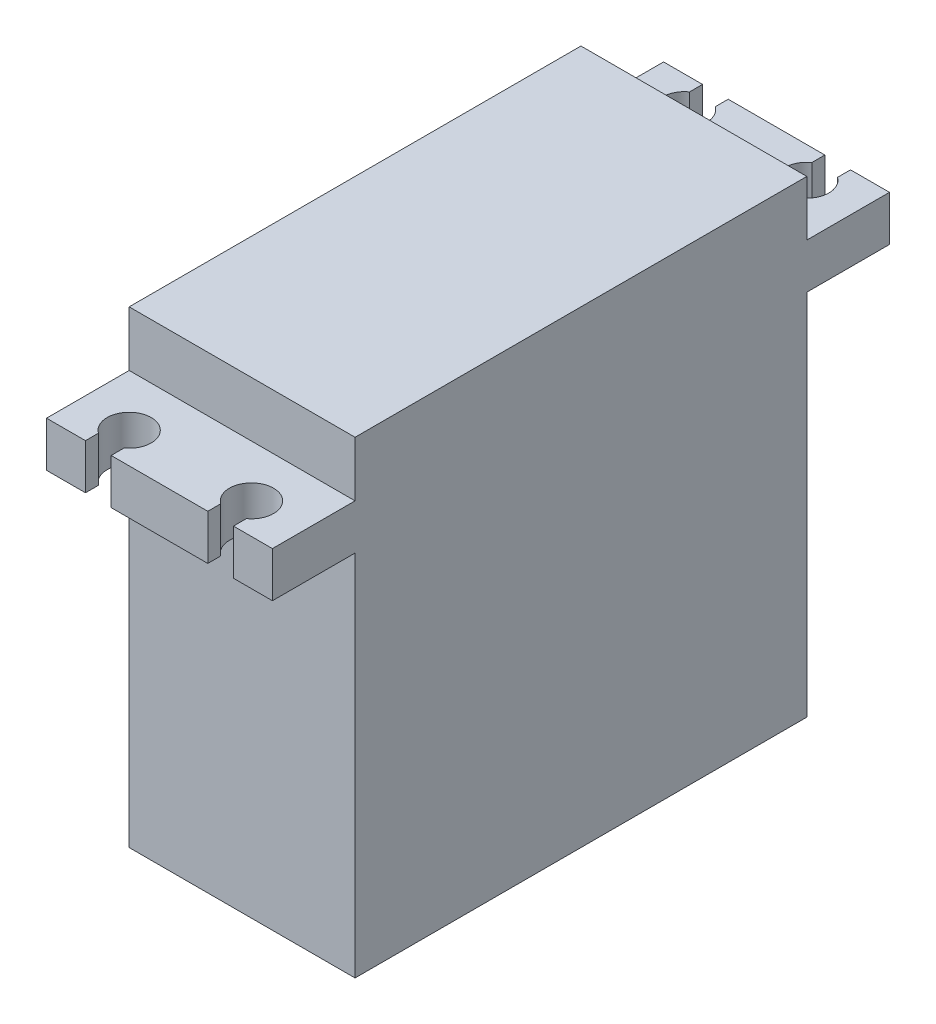
ISO-10303-21;
HEADER;
FILE_DESCRIPTION(('STEP AP214'),'2;1');
FILE_NAME('part.step','',(''),(''),'','','');
FILE_SCHEMA(('AUTOMOTIVE_DESIGN { 1 0 10303 214 1 1 1 1 }'));
ENDSEC;
DATA;
#1=APPLICATION_CONTEXT('core data for automotive mechanical design processes');
#2=APPLICATION_PROTOCOL_DEFINITION('international standard','automotive_design',2000,#1);
#3=PRODUCT_CONTEXT('',#1,'mechanical');
#4=PRODUCT('Part','Part','',(#3));
#5=PRODUCT_RELATED_PRODUCT_CATEGORY('part','',(#4));
#6=PRODUCT_DEFINITION_FORMATION('','',#4);
#7=PRODUCT_DEFINITION_CONTEXT('part definition',#1,'design');
#8=PRODUCT_DEFINITION('design','',#6,#7);
#9=PRODUCT_DEFINITION_SHAPE('','',#8);
#10=(LENGTH_UNIT() NAMED_UNIT(*) SI_UNIT(.MILLI.,.METRE.));
#11=(NAMED_UNIT(*) PLANE_ANGLE_UNIT() SI_UNIT($,.RADIAN.));
#12=(NAMED_UNIT(*) SI_UNIT($,.STERADIAN.) SOLID_ANGLE_UNIT());
#13=UNCERTAINTY_MEASURE_WITH_UNIT(LENGTH_MEASURE(1.E-05),#10,'distance_accuracy_value','');
#14=(GEOMETRIC_REPRESENTATION_CONTEXT(3) GLOBAL_UNCERTAINTY_ASSIGNED_CONTEXT((#13)) GLOBAL_UNIT_ASSIGNED_CONTEXT((#10,
#11,#12)) REPRESENTATION_CONTEXT('',''));
#15=CARTESIAN_POINT('',(0.,0.,0.));
#16=DIRECTION('',(0.,0.,1.));
#17=DIRECTION('',(1.,0.,0.));
#18=AXIS2_PLACEMENT_3D('',#15,#16,#17);
#19=CARTESIAN_POINT('',(0.,42.5,-20.5));
#20=DIRECTION('',(0.,0.,-1.));
#21=DIRECTION('',(-1.,0.,0.));
#22=AXIS2_PLACEMENT_3D('',#19,#20,#21);
#23=PLANE('',#22);
#24=DIRECTION('',(0.,-1.,0.));
#25=VECTOR('',#24,1.);
#26=CARTESIAN_POINT('',(-10.25,42.5,-20.5));
#27=LINE('',#26,#25);
#28=CARTESIAN_POINT('',(-10.25,33.4,-20.5));
#29=VERTEX_POINT('',#28);
#30=CARTESIAN_POINT('',(-10.25,0.,-20.5));
#31=VERTEX_POINT('',#30);
#32=EDGE_CURVE('E55',#29,#31,#27,.T.);
#33=ORIENTED_EDGE('',*,*,#32,.F.);
#34=DIRECTION('',(1.,0.,0.));
#35=VECTOR('',#34,1.);
#36=CARTESIAN_POINT('',(0.,33.4,-20.5));
#37=LINE('',#36,#35);
#38=CARTESIAN_POINT('',(10.25,33.4,-20.5));
#39=VERTEX_POINT('',#38);
#40=EDGE_CURVE('E50',#29,#39,#37,.T.);
#41=ORIENTED_EDGE('',*,*,#40,.T.);
#42=DIRECTION('',(0.,-1.,0.));
#43=VECTOR('',#42,1.);
#44=CARTESIAN_POINT('',(10.25,42.5,-20.5));
#45=LINE('',#44,#43);
#46=CARTESIAN_POINT('',(10.25,0.,-20.5));
#47=VERTEX_POINT('',#46);
#48=EDGE_CURVE('E43',#39,#47,#45,.T.);
#49=ORIENTED_EDGE('',*,*,#48,.T.);
#50=DIRECTION('',(1.,0.,0.));
#51=VECTOR('',#50,1.);
#52=CARTESIAN_POINT('',(0.,0.,-20.5));
#53=LINE('',#52,#51);
#54=EDGE_CURVE('E348',#31,#47,#53,.T.);
#55=ORIENTED_EDGE('',*,*,#54,.F.);
#56=EDGE_LOOP('',(#33,#41,#49,#55));
#57=FACE_BOUND('',#56,.T.);
#58=ADVANCED_FACE('F35',(#57),#23,.T.);
#59=CARTESIAN_POINT('',(0.,42.5,20.5));
#60=DIRECTION('',(0.,0.,-1.));
#61=DIRECTION('',(-1.,0.,0.));
#62=AXIS2_PLACEMENT_3D('',#59,#60,#61);
#63=PLANE('',#62);
#64=DIRECTION('',(1.,0.,0.));
#65=VECTOR('',#64,1.);
#66=CARTESIAN_POINT('',(0.,33.4,20.5));
#67=LINE('',#66,#65);
#68=CARTESIAN_POINT('',(-10.25,33.4,20.5));
#69=VERTEX_POINT('',#68);
#70=CARTESIAN_POINT('',(10.25,33.4,20.5));
#71=VERTEX_POINT('',#70);
#72=EDGE_CURVE('E303',#69,#71,#67,.T.);
#73=ORIENTED_EDGE('',*,*,#72,.F.);
#74=DIRECTION('',(0.,-1.,0.));
#75=VECTOR('',#74,1.);
#76=CARTESIAN_POINT('',(-10.25,42.5,20.5));
#77=LINE('',#76,#75);
#78=CARTESIAN_POINT('',(-10.25,0.,20.5));
#79=VERTEX_POINT('',#78);
#80=EDGE_CURVE('E359',#69,#79,#77,.T.);
#81=ORIENTED_EDGE('',*,*,#80,.T.);
#82=DIRECTION('',(1.,0.,0.));
#83=VECTOR('',#82,1.);
#84=CARTESIAN_POINT('',(0.,0.,20.5));
#85=LINE('',#84,#83);
#86=CARTESIAN_POINT('',(10.25,0.,20.5));
#87=VERTEX_POINT('',#86);
#88=EDGE_CURVE('E338',#79,#87,#85,.T.);
#89=ORIENTED_EDGE('',*,*,#88,.T.);
#90=DIRECTION('',(0.,-1.,0.));
#91=VECTOR('',#90,1.);
#92=CARTESIAN_POINT('',(10.25,42.5,20.5));
#93=LINE('',#92,#91);
#94=EDGE_CURVE('E345',#71,#87,#93,.T.);
#95=ORIENTED_EDGE('',*,*,#94,.F.);
#96=EDGE_LOOP('',(#73,#81,#89,#95));
#97=FACE_BOUND('',#96,.T.);
#98=ADVANCED_FACE('F385',(#97),#63,.F.);
#99=CARTESIAN_POINT('',(10.25,42.5,0.));
#100=DIRECTION('',(1.,0.,0.));
#101=DIRECTION('',(0.,0.,-1.));
#102=AXIS2_PLACEMENT_3D('',#99,#100,#101);
#103=PLANE('',#102);
#104=DIRECTION('',(0.,0.,1.));
#105=VECTOR('',#104,1.);
#106=CARTESIAN_POINT('',(10.25,0.,0.));
#107=LINE('',#106,#105);
#108=EDGE_CURVE('E333',#47,#87,#107,.T.);
#109=ORIENTED_EDGE('',*,*,#108,.F.);
#110=ORIENTED_EDGE('',*,*,#48,.F.);
#111=DIRECTION('',(0.,0.,1.));
#112=VECTOR('',#111,1.);
#113=CARTESIAN_POINT('',(10.25,33.4,0.));
#114=LINE('',#113,#112);
#115=CARTESIAN_POINT('',(10.25,33.4,-28.));
#116=VERTEX_POINT('',#115);
#117=EDGE_CURVE('E451',#116,#39,#114,.T.);
#118=ORIENTED_EDGE('',*,*,#117,.F.);
#119=DIRECTION('',(0.,-1.,0.));
#120=VECTOR('',#119,1.);
#121=CARTESIAN_POINT('',(10.25,37.5,-28.));
#122=LINE('',#121,#120);
#123=CARTESIAN_POINT('',(10.25,37.5,-28.));
#124=VERTEX_POINT('',#123);
#125=EDGE_CURVE('E456',#124,#116,#122,.T.);
#126=ORIENTED_EDGE('',*,*,#125,.F.);
#127=DIRECTION('',(0.,0.,1.));
#128=VECTOR('',#127,1.);
#129=CARTESIAN_POINT('',(10.25,37.5,0.));
#130=LINE('',#129,#128);
#131=CARTESIAN_POINT('',(10.25,37.5,-20.5));
#132=VERTEX_POINT('',#131);
#133=EDGE_CURVE('E418',#124,#132,#130,.T.);
#134=ORIENTED_EDGE('',*,*,#133,.T.);
#135=CARTESIAN_POINT('',(10.25,42.5,-20.5));
#136=VERTEX_POINT('',#135);
#137=EDGE_CURVE('E11',#136,#132,#45,.T.);
#138=ORIENTED_EDGE('',*,*,#137,.F.);
#139=DIRECTION('',(0.,0.,1.));
#140=VECTOR('',#139,1.);
#141=CARTESIAN_POINT('',(10.25,42.5,0.));
#142=LINE('',#141,#140);
#143=CARTESIAN_POINT('',(10.25,42.5,20.5));
#144=VERTEX_POINT('',#143);
#145=EDGE_CURVE('E334',#136,#144,#142,.T.);
#146=ORIENTED_EDGE('',*,*,#145,.T.);
#147=CARTESIAN_POINT('',(10.25,37.5,20.5));
#148=VERTEX_POINT('',#147);
#149=EDGE_CURVE('E356',#144,#148,#93,.T.);
#150=ORIENTED_EDGE('',*,*,#149,.T.);
#151=DIRECTION('',(0.,0.,-1.));
#152=VECTOR('',#151,1.);
#153=CARTESIAN_POINT('',(10.25,37.5,0.));
#154=LINE('',#153,#152);
#155=CARTESIAN_POINT('',(10.25,37.5,28.));
#156=VERTEX_POINT('',#155);
#157=EDGE_CURVE('E273',#156,#148,#154,.T.);
#158=ORIENTED_EDGE('',*,*,#157,.F.);
#159=DIRECTION('',(0.,-1.,0.));
#160=VECTOR('',#159,1.);
#161=CARTESIAN_POINT('',(10.25,37.5,28.));
#162=LINE('',#161,#160);
#163=CARTESIAN_POINT('',(10.25,33.4,28.));
#164=VERTEX_POINT('',#163);
#165=EDGE_CURVE('E314',#156,#164,#162,.T.);
#166=ORIENTED_EDGE('',*,*,#165,.T.);
#167=DIRECTION('',(0.,0.,-1.));
#168=VECTOR('',#167,1.);
#169=CARTESIAN_POINT('',(10.25,33.4,0.));
#170=LINE('',#169,#168);
#171=EDGE_CURVE('E301',#164,#71,#170,.T.);
#172=ORIENTED_EDGE('',*,*,#171,.T.);
#173=ORIENTED_EDGE('',*,*,#94,.T.);
#174=EDGE_LOOP('',(#109,#110,#118,#126,#134,#138,#146,#150,#158,#166,#172,#173));
#175=FACE_BOUND('',#174,.T.);
#176=ADVANCED_FACE('F37',(#175),#103,.T.);
#177=DIRECTION('',(1.,0.,0.));
#178=VECTOR('',#177,1.);
#179=CARTESIAN_POINT('',(0.,37.5,-20.5));
#180=LINE('',#179,#178);
#181=CARTESIAN_POINT('',(-10.25,37.5,-20.5));
#182=VERTEX_POINT('',#181);
#183=EDGE_CURVE('E416',#182,#132,#180,.T.);
#184=ORIENTED_EDGE('',*,*,#183,.F.);
#185=CARTESIAN_POINT('',(-10.25,42.5,-20.5));
#186=VERTEX_POINT('',#185);
#187=EDGE_CURVE('E362',#186,#182,#27,.T.);
#188=ORIENTED_EDGE('',*,*,#187,.F.);
#189=DIRECTION('',(1.,0.,0.));
#190=VECTOR('',#189,1.);
#191=CARTESIAN_POINT('',(0.,42.5,-20.5));
#192=LINE('',#191,#190);
#193=EDGE_CURVE('E337',#186,#136,#192,.T.);
#194=ORIENTED_EDGE('',*,*,#193,.T.);
#195=ORIENTED_EDGE('',*,*,#137,.T.);
#196=EDGE_LOOP('',(#184,#188,#194,#195));
#197=FACE_BOUND('',#196,.T.);
#198=ADVANCED_FACE('F414',(#197),#23,.T.);
#199=CARTESIAN_POINT('',(-10.25,42.5,0.));
#200=DIRECTION('',(1.,0.,0.));
#201=DIRECTION('',(0.,0.,-1.));
#202=AXIS2_PLACEMENT_3D('',#199,#200,#201);
#203=PLANE('',#202);
#204=DIRECTION('',(0.,0.,1.));
#205=VECTOR('',#204,1.);
#206=CARTESIAN_POINT('',(-10.25,0.,0.));
#207=LINE('',#206,#205);
#208=EDGE_CURVE('E351',#31,#79,#207,.T.);
#209=ORIENTED_EDGE('',*,*,#208,.T.);
#210=ORIENTED_EDGE('',*,*,#80,.F.);
#211=DIRECTION('',(0.,0.,1.));
#212=VECTOR('',#211,1.);
#213=CARTESIAN_POINT('',(-10.25,33.4,0.));
#214=LINE('',#213,#212);
#215=CARTESIAN_POINT('',(-10.25,33.4,28.));
#216=VERTEX_POINT('',#215);
#217=EDGE_CURVE('E306',#69,#216,#214,.T.);
#218=ORIENTED_EDGE('',*,*,#217,.T.);
#219=DIRECTION('',(0.,-1.,0.));
#220=VECTOR('',#219,1.);
#221=CARTESIAN_POINT('',(-10.25,37.5,28.));
#222=LINE('',#221,#220);
#223=CARTESIAN_POINT('',(-10.25,37.5,28.));
#224=VERTEX_POINT('',#223);
#225=EDGE_CURVE('E311',#224,#216,#222,.T.);
#226=ORIENTED_EDGE('',*,*,#225,.F.);
#227=DIRECTION('',(0.,0.,1.));
#228=VECTOR('',#227,1.);
#229=CARTESIAN_POINT('',(-10.25,37.5,0.));
#230=LINE('',#229,#228);
#231=CARTESIAN_POINT('',(-10.25,37.5,20.5));
#232=VERTEX_POINT('',#231);
#233=EDGE_CURVE('E278',#232,#224,#230,.T.);
#234=ORIENTED_EDGE('',*,*,#233,.F.);
#235=CARTESIAN_POINT('',(-10.25,42.5,20.5));
#236=VERTEX_POINT('',#235);
#237=EDGE_CURVE('E360',#236,#232,#77,.T.);
#238=ORIENTED_EDGE('',*,*,#237,.F.);
#239=DIRECTION('',(0.,0.,1.));
#240=VECTOR('',#239,1.);
#241=CARTESIAN_POINT('',(-10.25,42.5,0.));
#242=LINE('',#241,#240);
#243=EDGE_CURVE('E341',#186,#236,#242,.T.);
#244=ORIENTED_EDGE('',*,*,#243,.F.);
#245=ORIENTED_EDGE('',*,*,#187,.T.);
#246=DIRECTION('',(0.,0.,-1.));
#247=VECTOR('',#246,1.);
#248=CARTESIAN_POINT('',(-10.25,37.5,0.));
#249=LINE('',#248,#247);
#250=CARTESIAN_POINT('',(-10.25,37.5,-28.));
#251=VERTEX_POINT('',#250);
#252=EDGE_CURVE('E419',#182,#251,#249,.T.);
#253=ORIENTED_EDGE('',*,*,#252,.T.);
#254=DIRECTION('',(0.,-1.,0.));
#255=VECTOR('',#254,1.);
#256=CARTESIAN_POINT('',(-10.25,37.5,-28.));
#257=LINE('',#256,#255);
#258=CARTESIAN_POINT('',(-10.25,33.4,-28.));
#259=VERTEX_POINT('',#258);
#260=EDGE_CURVE('E458',#251,#259,#257,.T.);
#261=ORIENTED_EDGE('',*,*,#260,.T.);
#262=DIRECTION('',(0.,0.,-1.));
#263=VECTOR('',#262,1.);
#264=CARTESIAN_POINT('',(-10.25,33.4,0.));
#265=LINE('',#264,#263);
#266=EDGE_CURVE('E374',#29,#259,#265,.T.);
#267=ORIENTED_EDGE('',*,*,#266,.F.);
#268=ORIENTED_EDGE('',*,*,#32,.T.);
#269=EDGE_LOOP('',(#209,#210,#218,#226,#234,#238,#244,#245,#253,#261,#267,#268));
#270=FACE_BOUND('',#269,.T.);
#271=ADVANCED_FACE('F370',(#270),#203,.F.);
#272=ORIENTED_EDGE('',*,*,#237,.T.);
#273=DIRECTION('',(1.,0.,0.));
#274=VECTOR('',#273,1.);
#275=CARTESIAN_POINT('',(0.,37.5,20.5));
#276=LINE('',#275,#274);
#277=EDGE_CURVE('E275',#232,#148,#276,.T.);
#278=ORIENTED_EDGE('',*,*,#277,.T.);
#279=ORIENTED_EDGE('',*,*,#149,.F.);
#280=DIRECTION('',(1.,0.,0.));
#281=VECTOR('',#280,1.);
#282=CARTESIAN_POINT('',(0.,42.5,20.5));
#283=LINE('',#282,#281);
#284=EDGE_CURVE('E343',#236,#144,#283,.T.);
#285=ORIENTED_EDGE('',*,*,#284,.F.);
#286=EDGE_LOOP('',(#272,#278,#279,#285));
#287=FACE_BOUND('',#286,.T.);
#288=ADVANCED_FACE('F409',(#287),#63,.F.);
#289=CARTESIAN_POINT('',(0.,42.5,0.));
#290=DIRECTION('',(0.,1.,0.));
#291=DIRECTION('',(0.,0.,1.));
#292=AXIS2_PLACEMENT_3D('',#289,#290,#291);
#293=PLANE('',#292);
#294=ORIENTED_EDGE('',*,*,#145,.F.);
#295=ORIENTED_EDGE('',*,*,#193,.F.);
#296=ORIENTED_EDGE('',*,*,#243,.T.);
#297=ORIENTED_EDGE('',*,*,#284,.T.);
#298=EDGE_LOOP('',(#294,#295,#296,#297));
#299=FACE_BOUND('',#298,.T.);
#300=ADVANCED_FACE('F412',(#299),#293,.T.);
#301=CARTESIAN_POINT('',(0.,0.,0.));
#302=DIRECTION('',(0.,1.,0.));
#303=DIRECTION('',(0.,0.,1.));
#304=AXIS2_PLACEMENT_3D('',#301,#302,#303);
#305=PLANE('',#304);
#306=ORIENTED_EDGE('',*,*,#108,.T.);
#307=ORIENTED_EDGE('',*,*,#88,.F.);
#308=ORIENTED_EDGE('',*,*,#208,.F.);
#309=ORIENTED_EDGE('',*,*,#54,.T.);
#310=EDGE_LOOP('',(#306,#307,#308,#309));
#311=FACE_BOUND('',#310,.T.);
#312=ADVANCED_FACE('F376',(#311),#305,.F.);
#313=CARTESIAN_POINT('',(-6.71500000000001,37.5,0.));
#314=DIRECTION('',(-1.,0.,0.));
#315=DIRECTION('',(0.,0.,1.));
#316=AXIS2_PLACEMENT_3D('',#313,#314,#315);
#317=PLANE('',#316);
#318=DIRECTION('',(0.,0.,-1.));
#319=VECTOR('',#318,1.);
#320=CARTESIAN_POINT('',(-6.71500000000001,33.4,0.));
#321=LINE('',#320,#319);
#322=CARTESIAN_POINT('',(-6.71500000000001,33.4,28.));
#323=VERTEX_POINT('',#322);
#324=CARTESIAN_POINT('',(-6.71500000000001,33.4,26.82566140386));
#325=VERTEX_POINT('',#324);
#326=EDGE_CURVE('E243',#323,#325,#321,.T.);
#327=ORIENTED_EDGE('',*,*,#326,.T.);
#328=DIRECTION('',(0.,-1.,0.));
#329=VECTOR('',#328,1.);
#330=CARTESIAN_POINT('',(-6.71500000000001,37.5,26.82566140386));
#331=LINE('',#330,#329);
#332=CARTESIAN_POINT('',(-6.71500000000001,37.5,26.82566140386));
#333=VERTEX_POINT('',#332);
#334=EDGE_CURVE('E330',#333,#325,#331,.T.);
#335=ORIENTED_EDGE('',*,*,#334,.F.);
#336=DIRECTION('',(0.,0.,-1.));
#337=VECTOR('',#336,1.);
#338=CARTESIAN_POINT('',(-6.71500000000001,37.5,0.));
#339=LINE('',#338,#337);
#340=CARTESIAN_POINT('',(-6.71500000000001,37.5,28.));
#341=VERTEX_POINT('',#340);
#342=EDGE_CURVE('E252',#341,#333,#339,.T.);
#343=ORIENTED_EDGE('',*,*,#342,.F.);
#344=DIRECTION('',(0.,-1.,0.));
#345=VECTOR('',#344,1.);
#346=CARTESIAN_POINT('',(-6.71500000000001,37.5,28.));
#347=LINE('',#346,#345);
#348=EDGE_CURVE('E281',#341,#323,#347,.T.);
#349=ORIENTED_EDGE('',*,*,#348,.T.);
#350=EDGE_LOOP('',(#327,#335,#343,#349));
#351=FACE_BOUND('',#350,.T.);
#352=ADVANCED_FACE('F397',(#351),#317,.F.);
#353=CARTESIAN_POINT('',(-5.54999999999999,37.5,25.2));
#354=DIRECTION('',(0.,-1.,0.));
#355=DIRECTION('',(0.,0.,-1.));
#356=AXIS2_PLACEMENT_3D('',#353,#354,#355);
#357=CYLINDRICAL_SURFACE('',#356,1.99999999999999);
#358=CARTESIAN_POINT('',(-5.54999999999999,33.4,25.2));
#359=DIRECTION('',(0.,1.,0.));
#360=DIRECTION('',(0.,0.,1.));
#361=AXIS2_PLACEMENT_3D('',#358,#359,#360);
#362=CIRCLE('',#361,1.99999999999999);
#363=CARTESIAN_POINT('',(-4.38500000000001,33.4,26.82566140386));
#364=VERTEX_POINT('',#363);
#365=EDGE_CURVE('E246',#325,#364,#362,.F.);
#366=ORIENTED_EDGE('',*,*,#365,.T.);
#367=DIRECTION('',(0.,-1.,0.));
#368=VECTOR('',#367,1.);
#369=CARTESIAN_POINT('',(-4.38500000000001,37.5,26.82566140386));
#370=LINE('',#369,#368);
#371=CARTESIAN_POINT('',(-4.38500000000001,37.5,26.82566140386));
#372=VERTEX_POINT('',#371);
#373=EDGE_CURVE('E328',#372,#364,#370,.T.);
#374=ORIENTED_EDGE('',*,*,#373,.F.);
#375=CARTESIAN_POINT('',(-5.54999999999999,37.5,25.2));
#376=DIRECTION('',(0.,1.,0.));
#377=DIRECTION('',(0.,0.,1.));
#378=AXIS2_PLACEMENT_3D('',#375,#376,#377);
#379=CIRCLE('',#378,1.99999999999999);
#380=EDGE_CURVE('E255',#333,#372,#379,.F.);
#381=ORIENTED_EDGE('',*,*,#380,.F.);
#382=ORIENTED_EDGE('',*,*,#334,.T.);
#383=EDGE_LOOP('',(#366,#374,#381,#382));
#384=FACE_BOUND('',#383,.T.);
#385=ADVANCED_FACE('F593',(#384),#357,.F.);
#386=CARTESIAN_POINT('',(-4.38500000000001,37.5,0.));
#387=DIRECTION('',(-1.,0.,0.));
#388=DIRECTION('',(0.,0.,1.));
#389=AXIS2_PLACEMENT_3D('',#386,#387,#388);
#390=PLANE('',#389);
#391=DIRECTION('',(0.,0.,-1.));
#392=VECTOR('',#391,1.);
#393=CARTESIAN_POINT('',(-4.38500000000001,33.4,0.));
#394=LINE('',#393,#392);
#395=CARTESIAN_POINT('',(-4.38500000000001,33.4,28.));
#396=VERTEX_POINT('',#395);
#397=EDGE_CURVE('E285',#396,#364,#394,.T.);
#398=ORIENTED_EDGE('',*,*,#397,.F.);
#399=DIRECTION('',(0.,-1.,0.));
#400=VECTOR('',#399,1.);
#401=CARTESIAN_POINT('',(-4.38500000000001,37.5,28.));
#402=LINE('',#401,#400);
#403=CARTESIAN_POINT('',(-4.38500000000001,37.5,28.));
#404=VERTEX_POINT('',#403);
#405=EDGE_CURVE('E326',#404,#396,#402,.T.);
#406=ORIENTED_EDGE('',*,*,#405,.F.);
#407=DIRECTION('',(0.,0.,-1.));
#408=VECTOR('',#407,1.);
#409=CARTESIAN_POINT('',(-4.38500000000001,37.5,0.));
#410=LINE('',#409,#408);
#411=EDGE_CURVE('E258',#404,#372,#410,.T.);
#412=ORIENTED_EDGE('',*,*,#411,.T.);
#413=ORIENTED_EDGE('',*,*,#373,.T.);
#414=EDGE_LOOP('',(#398,#406,#412,#413));
#415=FACE_BOUND('',#414,.T.);
#416=ADVANCED_FACE('F601',(#415),#390,.T.);
#417=CARTESIAN_POINT('',(0.,37.5,28.));
#418=DIRECTION('',(0.,0.,-1.));
#419=DIRECTION('',(-1.,0.,0.));
#420=AXIS2_PLACEMENT_3D('',#417,#418,#419);
#421=PLANE('',#420);
#422=DIRECTION('',(1.,0.,0.));
#423=VECTOR('',#422,1.);
#424=CARTESIAN_POINT('',(0.,33.4,28.));
#425=LINE('',#424,#423);
#426=CARTESIAN_POINT('',(4.38500000000001,33.4,28.));
#427=VERTEX_POINT('',#426);
#428=EDGE_CURVE('E288',#396,#427,#425,.T.);
#429=ORIENTED_EDGE('',*,*,#428,.T.);
#430=DIRECTION('',(0.,-1.,0.));
#431=VECTOR('',#430,1.);
#432=CARTESIAN_POINT('',(4.38500000000001,37.5,28.));
#433=LINE('',#432,#431);
#434=CARTESIAN_POINT('',(4.38500000000001,37.5,28.));
#435=VERTEX_POINT('',#434);
#436=EDGE_CURVE('E323',#435,#427,#433,.T.);
#437=ORIENTED_EDGE('',*,*,#436,.F.);
#438=DIRECTION('',(1.,0.,0.));
#439=VECTOR('',#438,1.);
#440=CARTESIAN_POINT('',(0.,37.5,28.));
#441=LINE('',#440,#439);
#442=EDGE_CURVE('E261',#404,#435,#441,.T.);
#443=ORIENTED_EDGE('',*,*,#442,.F.);
#444=ORIENTED_EDGE('',*,*,#405,.T.);
#445=EDGE_LOOP('',(#429,#437,#443,#444));
#446=FACE_BOUND('',#445,.T.);
#447=ADVANCED_FACE('F610',(#446),#421,.F.);
#448=CARTESIAN_POINT('',(4.38500000000001,37.5,0.));
#449=DIRECTION('',(-1.,0.,0.));
#450=DIRECTION('',(0.,0.,1.));
#451=AXIS2_PLACEMENT_3D('',#448,#449,#450);
#452=PLANE('',#451);
#453=DIRECTION('',(0.,0.,-1.));
#454=VECTOR('',#453,1.);
#455=CARTESIAN_POINT('',(4.38500000000001,33.4,0.));
#456=LINE('',#455,#454);
#457=CARTESIAN_POINT('',(4.38500000000001,33.4,26.82566140386));
#458=VERTEX_POINT('',#457);
#459=EDGE_CURVE('E290',#427,#458,#456,.T.);
#460=ORIENTED_EDGE('',*,*,#459,.T.);
#461=DIRECTION('',(0.,-1.,0.));
#462=VECTOR('',#461,1.);
#463=CARTESIAN_POINT('',(4.38500000000001,37.5,26.82566140386));
#464=LINE('',#463,#462);
#465=CARTESIAN_POINT('',(4.38500000000001,37.5,26.82566140386));
#466=VERTEX_POINT('',#465);
#467=EDGE_CURVE('E321',#466,#458,#464,.T.);
#468=ORIENTED_EDGE('',*,*,#467,.F.);
#469=DIRECTION('',(0.,0.,-1.));
#470=VECTOR('',#469,1.);
#471=CARTESIAN_POINT('',(4.38500000000001,37.5,0.));
#472=LINE('',#471,#470);
#473=EDGE_CURVE('E263',#435,#466,#472,.T.);
#474=ORIENTED_EDGE('',*,*,#473,.F.);
#475=ORIENTED_EDGE('',*,*,#436,.T.);
#476=EDGE_LOOP('',(#460,#468,#474,#475));
#477=FACE_BOUND('',#476,.T.);
#478=ADVANCED_FACE('F619',(#477),#452,.F.);
#479=CARTESIAN_POINT('',(5.55,37.5,25.2));
#480=DIRECTION('',(0.,-1.,0.));
#481=DIRECTION('',(0.,0.,-1.));
#482=AXIS2_PLACEMENT_3D('',#479,#480,#481);
#483=CYLINDRICAL_SURFACE('',#482,1.99999999999999);
#484=CARTESIAN_POINT('',(5.55,33.4,25.2));
#485=DIRECTION('',(0.,1.,0.));
#486=DIRECTION('',(0.,0.,1.));
#487=AXIS2_PLACEMENT_3D('',#484,#485,#486);
#488=CIRCLE('',#487,1.99999999999999);
#489=CARTESIAN_POINT('',(6.71500000000001,33.4,26.82566140386));
#490=VERTEX_POINT('',#489);
#491=EDGE_CURVE('E293',#490,#458,#488,.T.);
#492=ORIENTED_EDGE('',*,*,#491,.F.);
#493=DIRECTION('',(0.,-1.,0.));
#494=VECTOR('',#493,1.);
#495=CARTESIAN_POINT('',(6.71500000000001,37.5,26.82566140386));
#496=LINE('',#495,#494);
#497=CARTESIAN_POINT('',(6.71500000000001,37.5,26.82566140386));
#498=VERTEX_POINT('',#497);
#499=EDGE_CURVE('E319',#498,#490,#496,.T.);
#500=ORIENTED_EDGE('',*,*,#499,.F.);
#501=CARTESIAN_POINT('',(5.55,37.5,25.2));
#502=DIRECTION('',(0.,1.,0.));
#503=DIRECTION('',(0.,0.,1.));
#504=AXIS2_PLACEMENT_3D('',#501,#502,#503);
#505=CIRCLE('',#504,1.99999999999999);
#506=EDGE_CURVE('E265',#498,#466,#505,.T.);
#507=ORIENTED_EDGE('',*,*,#506,.T.);
#508=ORIENTED_EDGE('',*,*,#467,.T.);
#509=EDGE_LOOP('',(#492,#500,#507,#508));
#510=FACE_BOUND('',#509,.T.);
#511=ADVANCED_FACE('F628',(#510),#483,.F.);
#512=CARTESIAN_POINT('',(6.71500000000001,37.5,0.));
#513=DIRECTION('',(-1.,0.,0.));
#514=DIRECTION('',(0.,0.,1.));
#515=AXIS2_PLACEMENT_3D('',#512,#513,#514);
#516=PLANE('',#515);
#517=DIRECTION('',(0.,0.,-1.));
#518=VECTOR('',#517,1.);
#519=CARTESIAN_POINT('',(6.71500000000001,33.4,0.));
#520=LINE('',#519,#518);
#521=CARTESIAN_POINT('',(6.71500000000001,33.4,28.));
#522=VERTEX_POINT('',#521);
#523=EDGE_CURVE('E296',#522,#490,#520,.T.);
#524=ORIENTED_EDGE('',*,*,#523,.F.);
#525=DIRECTION('',(0.,-1.,0.));
#526=VECTOR('',#525,1.);
#527=CARTESIAN_POINT('',(6.71500000000001,37.5,28.));
#528=LINE('',#527,#526);
#529=CARTESIAN_POINT('',(6.71500000000001,37.5,28.));
#530=VERTEX_POINT('',#529);
#531=EDGE_CURVE('E317',#530,#522,#528,.T.);
#532=ORIENTED_EDGE('',*,*,#531,.F.);
#533=DIRECTION('',(0.,0.,-1.));
#534=VECTOR('',#533,1.);
#535=CARTESIAN_POINT('',(6.71500000000001,37.5,0.));
#536=LINE('',#535,#534);
#537=EDGE_CURVE('E268',#530,#498,#536,.T.);
#538=ORIENTED_EDGE('',*,*,#537,.T.);
#539=ORIENTED_EDGE('',*,*,#499,.T.);
#540=EDGE_LOOP('',(#524,#532,#538,#539));
#541=FACE_BOUND('',#540,.T.);
#542=ADVANCED_FACE('F637',(#541),#516,.T.);
#543=CARTESIAN_POINT('',(-1.64884607617598E-13,37.5,28.));
#544=DIRECTION('',(0.,0.,-1.));
#545=DIRECTION('',(-1.,0.,0.));
#546=AXIS2_PLACEMENT_3D('',#543,#544,#545);
#547=PLANE('',#546);
#548=DIRECTION('',(1.,0.,0.));
#549=VECTOR('',#548,1.);
#550=CARTESIAN_POINT('',(-1.64884607617598E-13,33.4,28.));
#551=LINE('',#550,#549);
#552=EDGE_CURVE('E299',#522,#164,#551,.T.);
#553=ORIENTED_EDGE('',*,*,#552,.T.);
#554=ORIENTED_EDGE('',*,*,#165,.F.);
#555=DIRECTION('',(1.,0.,0.));
#556=VECTOR('',#555,1.);
#557=CARTESIAN_POINT('',(-1.64884607617598E-13,37.5,28.));
#558=LINE('',#557,#556);
#559=EDGE_CURVE('E271',#530,#156,#558,.T.);
#560=ORIENTED_EDGE('',*,*,#559,.F.);
#561=ORIENTED_EDGE('',*,*,#531,.T.);
#562=EDGE_LOOP('',(#553,#554,#560,#561));
#563=FACE_BOUND('',#562,.T.);
#564=ADVANCED_FACE('F646',(#563),#547,.F.);
#565=CARTESIAN_POINT('',(0.,37.5,28.));
#566=DIRECTION('',(0.,0.,-1.));
#567=DIRECTION('',(-1.,0.,0.));
#568=AXIS2_PLACEMENT_3D('',#565,#566,#567);
#569=PLANE('',#568);
#570=DIRECTION('',(1.,0.,0.));
#571=VECTOR('',#570,1.);
#572=CARTESIAN_POINT('',(0.,33.4,28.));
#573=LINE('',#572,#571);
#574=EDGE_CURVE('E256',#216,#323,#573,.T.);
#575=ORIENTED_EDGE('',*,*,#574,.T.);
#576=ORIENTED_EDGE('',*,*,#348,.F.);
#577=DIRECTION('',(1.,0.,0.));
#578=VECTOR('',#577,1.);
#579=CARTESIAN_POINT('',(0.,37.5,28.));
#580=LINE('',#579,#578);
#581=EDGE_CURVE('E280',#224,#341,#580,.T.);
#582=ORIENTED_EDGE('',*,*,#581,.F.);
#583=ORIENTED_EDGE('',*,*,#225,.T.);
#584=EDGE_LOOP('',(#575,#576,#582,#583));
#585=FACE_BOUND('',#584,.T.);
#586=ADVANCED_FACE('F391',(#585),#569,.F.);
#587=CARTESIAN_POINT('',(0.,37.5,0.));
#588=DIRECTION('',(0.,1.,0.));
#589=DIRECTION('',(0.,0.,1.));
#590=AXIS2_PLACEMENT_3D('',#587,#588,#589);
#591=PLANE('',#590);
#592=ORIENTED_EDGE('',*,*,#342,.T.);
#593=ORIENTED_EDGE('',*,*,#380,.T.);
#594=ORIENTED_EDGE('',*,*,#411,.F.);
#595=ORIENTED_EDGE('',*,*,#442,.T.);
#596=ORIENTED_EDGE('',*,*,#473,.T.);
#597=ORIENTED_EDGE('',*,*,#506,.F.);
#598=ORIENTED_EDGE('',*,*,#537,.F.);
#599=ORIENTED_EDGE('',*,*,#559,.T.);
#600=ORIENTED_EDGE('',*,*,#157,.T.);
#601=ORIENTED_EDGE('',*,*,#277,.F.);
#602=ORIENTED_EDGE('',*,*,#233,.T.);
#603=ORIENTED_EDGE('',*,*,#581,.T.);
#604=EDGE_LOOP('',(#592,#593,#594,#595,#596,#597,#598,#599,#600,#601,#602,#603));
#605=FACE_BOUND('',#604,.T.);
#606=ADVANCED_FACE('F400',(#605),#591,.T.);
#607=CARTESIAN_POINT('',(0.,33.4,0.));
#608=DIRECTION('',(0.,1.,0.));
#609=DIRECTION('',(0.,0.,1.));
#610=AXIS2_PLACEMENT_3D('',#607,#608,#609);
#611=PLANE('',#610);
#612=ORIENTED_EDGE('',*,*,#326,.F.);
#613=ORIENTED_EDGE('',*,*,#574,.F.);
#614=ORIENTED_EDGE('',*,*,#217,.F.);
#615=ORIENTED_EDGE('',*,*,#72,.T.);
#616=ORIENTED_EDGE('',*,*,#171,.F.);
#617=ORIENTED_EDGE('',*,*,#552,.F.);
#618=ORIENTED_EDGE('',*,*,#523,.T.);
#619=ORIENTED_EDGE('',*,*,#491,.T.);
#620=ORIENTED_EDGE('',*,*,#459,.F.);
#621=ORIENTED_EDGE('',*,*,#428,.F.);
#622=ORIENTED_EDGE('',*,*,#397,.T.);
#623=ORIENTED_EDGE('',*,*,#365,.F.);
#624=EDGE_LOOP('',(#612,#613,#614,#615,#616,#617,#618,#619,#620,#621,#622,#623));
#625=FACE_BOUND('',#624,.T.);
#626=ADVANCED_FACE('F394',(#625),#611,.F.);
#627=CARTESIAN_POINT('',(6.71500000000001,37.5,0.));
#628=DIRECTION('',(1.,0.,0.));
#629=DIRECTION('',(0.,0.,-1.));
#630=AXIS2_PLACEMENT_3D('',#627,#628,#629);
#631=PLANE('',#630);
#632=DIRECTION('',(0.,0.,1.));
#633=VECTOR('',#632,1.);
#634=CARTESIAN_POINT('',(6.71500000000001,33.4,0.));
#635=LINE('',#634,#633);
#636=CARTESIAN_POINT('',(6.71500000000001,33.4,-28.));
#637=VERTEX_POINT('',#636);
#638=CARTESIAN_POINT('',(6.71500000000001,33.4,-26.82566140386));
#639=VERTEX_POINT('',#638);
#640=EDGE_CURVE('E242',#637,#639,#635,.T.);
#641=ORIENTED_EDGE('',*,*,#640,.T.);
#642=DIRECTION('',(0.,-1.,0.));
#643=VECTOR('',#642,1.);
#644=CARTESIAN_POINT('',(6.71500000000001,37.5,-26.82566140386));
#645=LINE('',#644,#643);
#646=CARTESIAN_POINT('',(6.71500000000001,37.5,-26.82566140386));
#647=VERTEX_POINT('',#646);
#648=EDGE_CURVE('E222',#647,#639,#645,.T.);
#649=ORIENTED_EDGE('',*,*,#648,.F.);
#650=DIRECTION('',(0.,0.,1.));
#651=VECTOR('',#650,1.);
#652=CARTESIAN_POINT('',(6.71500000000001,37.5,0.));
#653=LINE('',#652,#651);
#654=CARTESIAN_POINT('',(6.71500000000001,37.5,-28.));
#655=VERTEX_POINT('',#654);
#656=EDGE_CURVE('E229',#655,#647,#653,.T.);
#657=ORIENTED_EDGE('',*,*,#656,.F.);
#658=DIRECTION('',(0.,-1.,0.));
#659=VECTOR('',#658,1.);
#660=CARTESIAN_POINT('',(6.71500000000001,37.5,-28.));
#661=LINE('',#660,#659);
#662=EDGE_CURVE('E427',#655,#637,#661,.T.);
#663=ORIENTED_EDGE('',*,*,#662,.T.);
#664=EDGE_LOOP('',(#641,#649,#657,#663));
#665=FACE_BOUND('',#664,.T.);
#666=ADVANCED_FACE('F240',(#665),#631,.F.);
#667=CARTESIAN_POINT('',(5.55,37.5,-25.2));
#668=DIRECTION('',(0.,-1.,0.));
#669=DIRECTION('',(0.,0.,-1.));
#670=AXIS2_PLACEMENT_3D('',#667,#668,#669);
#671=CYLINDRICAL_SURFACE('',#670,1.99999999999999);
#672=CARTESIAN_POINT('',(5.55,33.4,-25.2));
#673=DIRECTION('',(0.,1.,0.));
#674=DIRECTION('',(0.,0.,1.));
#675=AXIS2_PLACEMENT_3D('',#672,#673,#674);
#676=CIRCLE('',#675,1.99999999999999);
#677=CARTESIAN_POINT('',(4.38500000000001,33.4,-26.82566140386));
#678=VERTEX_POINT('',#677);
#679=EDGE_CURVE('E429',#639,#678,#676,.F.);
#680=ORIENTED_EDGE('',*,*,#679,.T.);
#681=DIRECTION('',(0.,-1.,0.));
#682=VECTOR('',#681,1.);
#683=CARTESIAN_POINT('',(4.38500000000001,37.5,-26.82566140386));
#684=LINE('',#683,#682);
#685=CARTESIAN_POINT('',(4.38500000000001,37.5,-26.82566140386));
#686=VERTEX_POINT('',#685);
#687=EDGE_CURVE('E224',#686,#678,#684,.T.);
#688=ORIENTED_EDGE('',*,*,#687,.F.);
#689=CARTESIAN_POINT('',(5.55,37.5,-25.2));
#690=DIRECTION('',(0.,1.,0.));
#691=DIRECTION('',(0.,0.,1.));
#692=AXIS2_PLACEMENT_3D('',#689,#690,#691);
#693=CIRCLE('',#692,1.99999999999999);
#694=EDGE_CURVE('E217',#647,#686,#693,.F.);
#695=ORIENTED_EDGE('',*,*,#694,.F.);
#696=ORIENTED_EDGE('',*,*,#648,.T.);
#697=EDGE_LOOP('',(#680,#688,#695,#696));
#698=FACE_BOUND('',#697,.T.);
#699=ADVANCED_FACE('F220',(#698),#671,.F.);
#700=CARTESIAN_POINT('',(4.38500000000001,37.5,0.));
#701=DIRECTION('',(1.,0.,0.));
#702=DIRECTION('',(0.,0.,-1.));
#703=AXIS2_PLACEMENT_3D('',#700,#701,#702);
#704=PLANE('',#703);
#705=DIRECTION('',(0.,0.,1.));
#706=VECTOR('',#705,1.);
#707=CARTESIAN_POINT('',(4.38500000000001,33.4,0.));
#708=LINE('',#707,#706);
#709=CARTESIAN_POINT('',(4.38500000000001,33.4,-28.));
#710=VERTEX_POINT('',#709);
#711=EDGE_CURVE('E431',#710,#678,#708,.T.);
#712=ORIENTED_EDGE('',*,*,#711,.F.);
#713=DIRECTION('',(0.,-1.,0.));
#714=VECTOR('',#713,1.);
#715=CARTESIAN_POINT('',(4.38500000000001,37.5,-28.));
#716=LINE('',#715,#714);
#717=CARTESIAN_POINT('',(4.38500000000001,37.5,-28.));
#718=VERTEX_POINT('',#717);
#719=EDGE_CURVE('E248',#718,#710,#716,.T.);
#720=ORIENTED_EDGE('',*,*,#719,.F.);
#721=DIRECTION('',(0.,0.,1.));
#722=VECTOR('',#721,1.);
#723=CARTESIAN_POINT('',(4.38500000000001,37.5,0.));
#724=LINE('',#723,#722);
#725=EDGE_CURVE('E228',#718,#686,#724,.T.);
#726=ORIENTED_EDGE('',*,*,#725,.T.);
#727=ORIENTED_EDGE('',*,*,#687,.T.);
#728=EDGE_LOOP('',(#712,#720,#726,#727));
#729=FACE_BOUND('',#728,.T.);
#730=ADVANCED_FACE('F475',(#729),#704,.T.);
#731=CARTESIAN_POINT('',(0.,37.5,-28.));
#732=DIRECTION('',(0.,0.,-1.));
#733=DIRECTION('',(-1.,0.,0.));
#734=AXIS2_PLACEMENT_3D('',#731,#732,#733);
#735=PLANE('',#734);
#736=DIRECTION('',(1.,0.,0.));
#737=VECTOR('',#736,1.);
#738=CARTESIAN_POINT('',(0.,33.4,-28.));
#739=LINE('',#738,#737);
#740=CARTESIAN_POINT('',(-4.38500000000001,33.4,-28.));
#741=VERTEX_POINT('',#740);
#742=EDGE_CURVE('E434',#741,#710,#739,.T.);
#743=ORIENTED_EDGE('',*,*,#742,.F.);
#744=DIRECTION('',(0.,-1.,0.));
#745=VECTOR('',#744,1.);
#746=CARTESIAN_POINT('',(-4.38500000000001,37.5,-28.));
#747=LINE('',#746,#745);
#748=CARTESIAN_POINT('',(-4.38500000000001,37.5,-28.));
#749=VERTEX_POINT('',#748);
#750=EDGE_CURVE('E466',#749,#741,#747,.T.);
#751=ORIENTED_EDGE('',*,*,#750,.F.);
#752=DIRECTION('',(1.,0.,0.));
#753=VECTOR('',#752,1.);
#754=CARTESIAN_POINT('',(0.,37.5,-28.));
#755=LINE('',#754,#753);
#756=EDGE_CURVE('E473',#749,#718,#755,.T.);
#757=ORIENTED_EDGE('',*,*,#756,.T.);
#758=ORIENTED_EDGE('',*,*,#719,.T.);
#759=EDGE_LOOP('',(#743,#751,#757,#758));
#760=FACE_BOUND('',#759,.T.);
#761=ADVANCED_FACE('F471',(#760),#735,.T.);
#762=CARTESIAN_POINT('',(-4.38500000000001,37.5,0.));
#763=DIRECTION('',(1.,0.,0.));
#764=DIRECTION('',(0.,0.,-1.));
#765=AXIS2_PLACEMENT_3D('',#762,#763,#764);
#766=PLANE('',#765);
#767=DIRECTION('',(0.,0.,1.));
#768=VECTOR('',#767,1.);
#769=CARTESIAN_POINT('',(-4.38500000000001,33.4,0.));
#770=LINE('',#769,#768);
#771=CARTESIAN_POINT('',(-4.38500000000001,33.4,-26.82566140386));
#772=VERTEX_POINT('',#771);
#773=EDGE_CURVE('E437',#741,#772,#770,.T.);
#774=ORIENTED_EDGE('',*,*,#773,.T.);
#775=DIRECTION('',(0.,-1.,0.));
#776=VECTOR('',#775,1.);
#777=CARTESIAN_POINT('',(-4.38500000000001,37.5,-26.82566140386));
#778=LINE('',#777,#776);
#779=CARTESIAN_POINT('',(-4.38500000000001,37.5,-26.82566140386));
#780=VERTEX_POINT('',#779);
#781=EDGE_CURVE('E464',#780,#772,#778,.T.);
#782=ORIENTED_EDGE('',*,*,#781,.F.);
#783=DIRECTION('',(0.,0.,1.));
#784=VECTOR('',#783,1.);
#785=CARTESIAN_POINT('',(-4.38500000000001,37.5,0.));
#786=LINE('',#785,#784);
#787=EDGE_CURVE('E485',#749,#780,#786,.T.);
#788=ORIENTED_EDGE('',*,*,#787,.F.);
#789=ORIENTED_EDGE('',*,*,#750,.T.);
#790=EDGE_LOOP('',(#774,#782,#788,#789));
#791=FACE_BOUND('',#790,.T.);
#792=ADVANCED_FACE('F482',(#791),#766,.F.);
#793=CARTESIAN_POINT('',(-5.54999999999999,37.5,-25.2));
#794=DIRECTION('',(0.,-1.,0.));
#795=DIRECTION('',(0.,0.,-1.));
#796=AXIS2_PLACEMENT_3D('',#793,#794,#795);
#797=CYLINDRICAL_SURFACE('',#796,1.99999999999999);
#798=CARTESIAN_POINT('',(-5.54999999999999,33.4,-25.2));
#799=DIRECTION('',(0.,1.,0.));
#800=DIRECTION('',(0.,0.,1.));
#801=AXIS2_PLACEMENT_3D('',#798,#799,#800);
#802=CIRCLE('',#801,1.99999999999999);
#803=CARTESIAN_POINT('',(-6.71500000000001,33.4,-26.82566140386));
#804=VERTEX_POINT('',#803);
#805=EDGE_CURVE('E440',#804,#772,#802,.T.);
#806=ORIENTED_EDGE('',*,*,#805,.F.);
#807=DIRECTION('',(0.,-1.,0.));
#808=VECTOR('',#807,1.);
#809=CARTESIAN_POINT('',(-6.71500000000001,37.5,-26.82566140386));
#810=LINE('',#809,#808);
#811=CARTESIAN_POINT('',(-6.71500000000001,37.5,-26.82566140386));
#812=VERTEX_POINT('',#811);
#813=EDGE_CURVE('E462',#812,#804,#810,.T.);
#814=ORIENTED_EDGE('',*,*,#813,.F.);
#815=CARTESIAN_POINT('',(-5.54999999999999,37.5,-25.2));
#816=DIRECTION('',(0.,1.,0.));
#817=DIRECTION('',(0.,0.,1.));
#818=AXIS2_PLACEMENT_3D('',#815,#816,#817);
#819=CIRCLE('',#818,1.99999999999999);
#820=EDGE_CURVE('E487',#812,#780,#819,.T.);
#821=ORIENTED_EDGE('',*,*,#820,.T.);
#822=ORIENTED_EDGE('',*,*,#781,.T.);
#823=EDGE_LOOP('',(#806,#814,#821,#822));
#824=FACE_BOUND('',#823,.T.);
#825=ADVANCED_FACE('F712',(#824),#797,.F.);
#826=CARTESIAN_POINT('',(-6.71500000000001,37.5,0.));
#827=DIRECTION('',(1.,0.,0.));
#828=DIRECTION('',(0.,0.,-1.));
#829=AXIS2_PLACEMENT_3D('',#826,#827,#828);
#830=PLANE('',#829);
#831=DIRECTION('',(0.,0.,1.));
#832=VECTOR('',#831,1.);
#833=CARTESIAN_POINT('',(-6.71500000000001,33.4,0.));
#834=LINE('',#833,#832);
#835=CARTESIAN_POINT('',(-6.71500000000001,33.4,-28.));
#836=VERTEX_POINT('',#835);
#837=EDGE_CURVE('E443',#836,#804,#834,.T.);
#838=ORIENTED_EDGE('',*,*,#837,.F.);
#839=DIRECTION('',(0.,-1.,0.));
#840=VECTOR('',#839,1.);
#841=CARTESIAN_POINT('',(-6.71500000000001,37.5,-28.));
#842=LINE('',#841,#840);
#843=CARTESIAN_POINT('',(-6.71500000000001,37.5,-28.));
#844=VERTEX_POINT('',#843);
#845=EDGE_CURVE('E460',#844,#836,#842,.T.);
#846=ORIENTED_EDGE('',*,*,#845,.F.);
#847=DIRECTION('',(0.,0.,1.));
#848=VECTOR('',#847,1.);
#849=CARTESIAN_POINT('',(-6.71500000000001,37.5,0.));
#850=LINE('',#849,#848);
#851=EDGE_CURVE('E493',#844,#812,#850,.T.);
#852=ORIENTED_EDGE('',*,*,#851,.T.);
#853=ORIENTED_EDGE('',*,*,#813,.T.);
#854=EDGE_LOOP('',(#838,#846,#852,#853));
#855=FACE_BOUND('',#854,.T.);
#856=ADVANCED_FACE('F512',(#855),#830,.T.);
#857=CARTESIAN_POINT('',(0.,37.5,-28.));
#858=DIRECTION('',(0.,0.,-1.));
#859=DIRECTION('',(-1.,0.,0.));
#860=AXIS2_PLACEMENT_3D('',#857,#858,#859);
#861=PLANE('',#860);
#862=DIRECTION('',(1.,0.,0.));
#863=VECTOR('',#862,1.);
#864=CARTESIAN_POINT('',(0.,33.4,-28.));
#865=LINE('',#864,#863);
#866=EDGE_CURVE('E446',#259,#836,#865,.T.);
#867=ORIENTED_EDGE('',*,*,#866,.F.);
#868=ORIENTED_EDGE('',*,*,#260,.F.);
#869=DIRECTION('',(1.,0.,0.));
#870=VECTOR('',#869,1.);
#871=CARTESIAN_POINT('',(0.,37.5,-28.));
#872=LINE('',#871,#870);
#873=EDGE_CURVE('E422',#251,#844,#872,.T.);
#874=ORIENTED_EDGE('',*,*,#873,.T.);
#875=ORIENTED_EDGE('',*,*,#845,.T.);
#876=EDGE_LOOP('',(#867,#868,#874,#875));
#877=FACE_BOUND('',#876,.T.);
#878=ADVANCED_FACE('F499',(#877),#861,.T.);
#879=CARTESIAN_POINT('',(0.,37.5,-28.));
#880=DIRECTION('',(0.,0.,-1.));
#881=DIRECTION('',(-1.,0.,0.));
#882=AXIS2_PLACEMENT_3D('',#879,#880,#881);
#883=PLANE('',#882);
#884=DIRECTION('',(1.,0.,0.));
#885=VECTOR('',#884,1.);
#886=CARTESIAN_POINT('',(0.,33.4,-28.));
#887=LINE('',#886,#885);
#888=EDGE_CURVE('E238',#637,#116,#887,.T.);
#889=ORIENTED_EDGE('',*,*,#888,.F.);
#890=ORIENTED_EDGE('',*,*,#662,.F.);
#891=DIRECTION('',(1.,0.,0.));
#892=VECTOR('',#891,1.);
#893=CARTESIAN_POINT('',(0.,37.5,-28.));
#894=LINE('',#893,#892);
#895=EDGE_CURVE('E236',#655,#124,#894,.T.);
#896=ORIENTED_EDGE('',*,*,#895,.T.);
#897=ORIENTED_EDGE('',*,*,#125,.T.);
#898=EDGE_LOOP('',(#889,#890,#896,#897));
#899=FACE_BOUND('',#898,.T.);
#900=ADVANCED_FACE('F504',(#899),#883,.T.);
#901=CARTESIAN_POINT('',(0.,37.5,0.));
#902=DIRECTION('',(0.,1.,0.));
#903=DIRECTION('',(0.,0.,1.));
#904=AXIS2_PLACEMENT_3D('',#901,#902,#903);
#905=PLANE('',#904);
#906=ORIENTED_EDGE('',*,*,#656,.T.);
#907=ORIENTED_EDGE('',*,*,#694,.T.);
#908=ORIENTED_EDGE('',*,*,#725,.F.);
#909=ORIENTED_EDGE('',*,*,#756,.F.);
#910=ORIENTED_EDGE('',*,*,#787,.T.);
#911=ORIENTED_EDGE('',*,*,#820,.F.);
#912=ORIENTED_EDGE('',*,*,#851,.F.);
#913=ORIENTED_EDGE('',*,*,#873,.F.);
#914=ORIENTED_EDGE('',*,*,#252,.F.);
#915=ORIENTED_EDGE('',*,*,#183,.T.);
#916=ORIENTED_EDGE('',*,*,#133,.F.);
#917=ORIENTED_EDGE('',*,*,#895,.F.);
#918=EDGE_LOOP('',(#906,#907,#908,#909,#910,#911,#912,#913,#914,#915,#916,#917));
#919=FACE_BOUND('',#918,.T.);
#920=ADVANCED_FACE('F233',(#919),#905,.T.);
#921=CARTESIAN_POINT('',(0.,33.4,0.));
#922=DIRECTION('',(0.,1.,0.));
#923=DIRECTION('',(0.,0.,1.));
#924=AXIS2_PLACEMENT_3D('',#921,#922,#923);
#925=PLANE('',#924);
#926=ORIENTED_EDGE('',*,*,#640,.F.);
#927=ORIENTED_EDGE('',*,*,#888,.T.);
#928=ORIENTED_EDGE('',*,*,#117,.T.);
#929=ORIENTED_EDGE('',*,*,#40,.F.);
#930=ORIENTED_EDGE('',*,*,#266,.T.);
#931=ORIENTED_EDGE('',*,*,#866,.T.);
#932=ORIENTED_EDGE('',*,*,#837,.T.);
#933=ORIENTED_EDGE('',*,*,#805,.T.);
#934=ORIENTED_EDGE('',*,*,#773,.F.);
#935=ORIENTED_EDGE('',*,*,#742,.T.);
#936=ORIENTED_EDGE('',*,*,#711,.T.);
#937=ORIENTED_EDGE('',*,*,#679,.F.);
#938=EDGE_LOOP('',(#926,#927,#928,#929,#930,#931,#932,#933,#934,#935,#936,#937));
#939=FACE_BOUND('',#938,.T.);
#940=ADVANCED_FACE('F478',(#939),#925,.F.);
#941=CLOSED_SHELL('',(#58,#98,#176,#198,#271,#288,#300,#312,#352,#385,#416,#447,#478,#511,#542,
#564,#586,#606,#626,#666,#699,#730,#761,#792,#825,#856,#878,#900,#920,#940));
#942=MANIFOLD_SOLID_BREP('B2',#941);
#943=ADVANCED_BREP_SHAPE_REPRESENTATION('',(#18,#942),#14);
#944=SHAPE_DEFINITION_REPRESENTATION(#9,#943);
ENDSEC;
END-ISO-10303-21;
